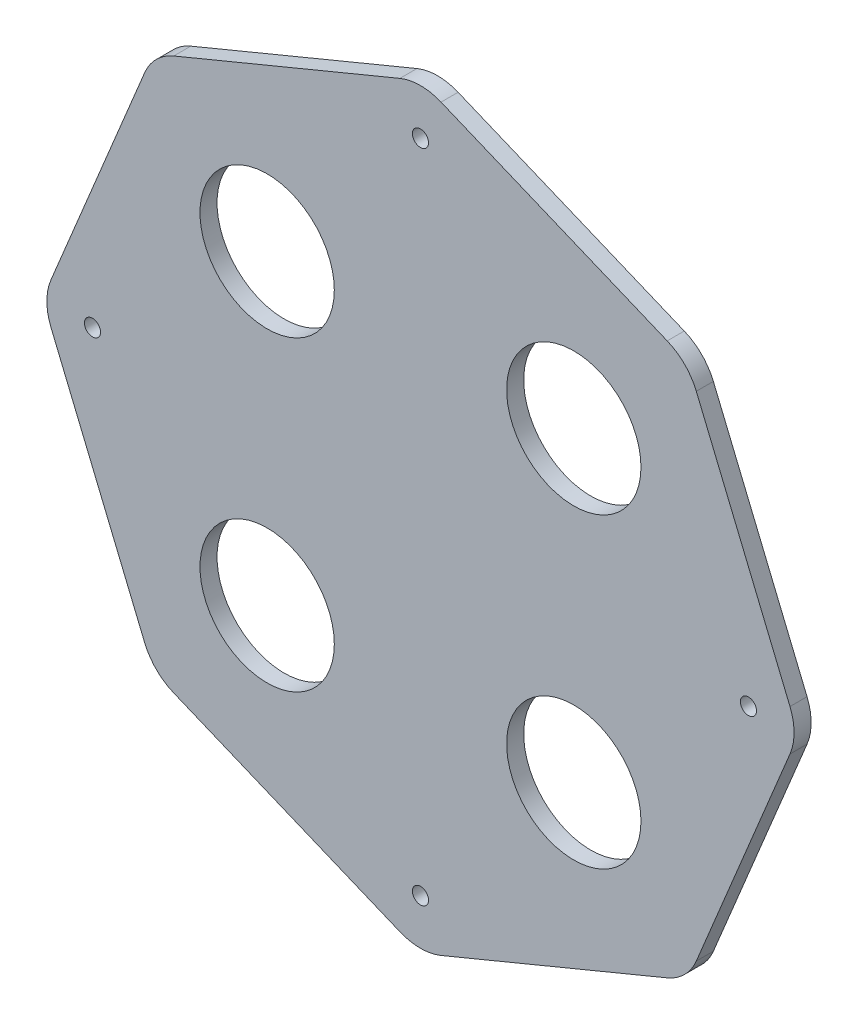
ISO-10303-21;
HEADER;
FILE_DESCRIPTION(('STEP AP214'),'2;1');
FILE_NAME('part.step','',(''),(''),'','','');
FILE_SCHEMA(('AUTOMOTIVE_DESIGN { 1 0 10303 214 1 1 1 1 }'));
ENDSEC;
DATA;
#1=APPLICATION_CONTEXT('core data for automotive mechanical design processes');
#2=APPLICATION_PROTOCOL_DEFINITION('international standard','automotive_design',2000,#1);
#3=PRODUCT_CONTEXT('',#1,'mechanical');
#4=PRODUCT('Part','Part','',(#3));
#5=PRODUCT_RELATED_PRODUCT_CATEGORY('part','',(#4));
#6=PRODUCT_DEFINITION_FORMATION('','',#4);
#7=PRODUCT_DEFINITION_CONTEXT('part definition',#1,'design');
#8=PRODUCT_DEFINITION('design','',#6,#7);
#9=PRODUCT_DEFINITION_SHAPE('','',#8);
#10=(LENGTH_UNIT() NAMED_UNIT(*) SI_UNIT(.MILLI.,.METRE.));
#11=(NAMED_UNIT(*) PLANE_ANGLE_UNIT() SI_UNIT($,.RADIAN.));
#12=(NAMED_UNIT(*) SI_UNIT($,.STERADIAN.) SOLID_ANGLE_UNIT());
#13=UNCERTAINTY_MEASURE_WITH_UNIT(LENGTH_MEASURE(1.E-05),#10,'distance_accuracy_value','');
#14=(GEOMETRIC_REPRESENTATION_CONTEXT(3) GLOBAL_UNCERTAINTY_ASSIGNED_CONTEXT((#13)) GLOBAL_UNIT_ASSIGNED_CONTEXT((#10,
#11,#12)) REPRESENTATION_CONTEXT('',''));
#15=CARTESIAN_POINT('',(0.,0.,0.));
#16=DIRECTION('',(0.,0.,1.));
#17=DIRECTION('',(1.,0.,0.));
#18=AXIS2_PLACEMENT_3D('',#15,#16,#17);
#19=CARTESIAN_POINT('',(0.,0.,3.175));
#20=DIRECTION('',(0.,0.,1.));
#21=DIRECTION('',(1.,0.,0.));
#22=AXIS2_PLACEMENT_3D('',#19,#20,#21);
#23=PLANE('',#22);
#24=CARTESIAN_POINT('',(-28.5356427718649,-28.5356427718656,3.175));
#25=DIRECTION('',(0.,0.,1.));
#26=DIRECTION('',(1.,0.,0.));
#27=AXIS2_PLACEMENT_3D('',#24,#25,#26);
#28=CIRCLE('',#27,12.5);
#29=CARTESIAN_POINT('',(-16.0356427718649,-28.5356427718656,3.175));
#30=VERTEX_POINT('',#29);
#31=EDGE_CURVE('E397',#30,#30,#28,.T.);
#32=ORIENTED_EDGE('',*,*,#31,.F.);
#33=EDGE_LOOP('',(#32));
#34=FACE_BOUND('',#33,.T.);
#35=CARTESIAN_POINT('',(-28.5356427718656,28.5356427718649,3.175));
#36=DIRECTION('',(0.,0.,1.));
#37=DIRECTION('',(1.,0.,0.));
#38=AXIS2_PLACEMENT_3D('',#35,#36,#37);
#39=CIRCLE('',#38,12.5);
#40=CARTESIAN_POINT('',(-16.0356427718656,28.5356427718649,3.175));
#41=VERTEX_POINT('',#40);
#42=EDGE_CURVE('E385',#41,#41,#39,.T.);
#43=ORIENTED_EDGE('',*,*,#42,.F.);
#44=EDGE_LOOP('',(#43));
#45=FACE_BOUND('',#44,.T.);
#46=CARTESIAN_POINT('',(0.,-61.04,3.175));
#47=DIRECTION('',(0.,0.,1.));
#48=DIRECTION('',(1.,0.,0.));
#49=AXIS2_PLACEMENT_3D('',#46,#47,#48);
#50=CIRCLE('',#49,1.5);
#51=CARTESIAN_POINT('',(1.50000000000001,-61.04,3.175));
#52=VERTEX_POINT('',#51);
#53=EDGE_CURVE('E373',#52,#52,#50,.T.);
#54=ORIENTED_EDGE('',*,*,#53,.F.);
#55=EDGE_LOOP('',(#54));
#56=FACE_BOUND('',#55,.T.);
#57=CARTESIAN_POINT('',(0.,61.04,3.175));
#58=DIRECTION('',(0.,0.,1.));
#59=DIRECTION('',(1.,0.,0.));
#60=AXIS2_PLACEMENT_3D('',#57,#58,#59);
#61=CIRCLE('',#60,1.5);
#62=CARTESIAN_POINT('',(1.49999999999997,61.04,3.175));
#63=VERTEX_POINT('',#62);
#64=EDGE_CURVE('E272',#63,#63,#61,.T.);
#65=ORIENTED_EDGE('',*,*,#64,.F.);
#66=EDGE_LOOP('',(#65));
#67=FACE_BOUND('',#66,.T.);
#68=DIRECTION('',(-0.923879532511286,-0.382683432365091,0.));
#69=VECTOR('',#68,1.);
#70=CARTESIAN_POINT('',(0.,70.3554930190056,3.175));
#71=LINE('',#70,#69);
#72=CARTESIAN_POINT('',(-3.82683432365083,68.7703663411945,3.175));
#73=VERTEX_POINT('',#72);
#74=CARTESIAN_POINT('',(-45.9220118838111,51.3339728852725,3.175));
#75=VERTEX_POINT('',#74);
#76=EDGE_CURVE('E251',#73,#75,#71,.T.);
#77=ORIENTED_EDGE('',*,*,#76,.T.);
#78=CARTESIAN_POINT('',(-42.0951775601602,42.0951775601596,3.175));
#79=DIRECTION('',(0.,0.,1.));
#80=DIRECTION('',(1.,0.,0.));
#81=AXIS2_PLACEMENT_3D('',#78,#79,#80);
#82=CIRCLE('',#81,10.);
#83=CARTESIAN_POINT('',(-51.3339728852731,45.9220118838104,3.175));
#84=VERTEX_POINT('',#83);
#85=EDGE_CURVE('E11',#75,#84,#82,.T.);
#86=ORIENTED_EDGE('',*,*,#85,.T.);
#87=DIRECTION('',(-0.382683432365086,-0.923879532511288,0.));
#88=VECTOR('',#87,1.);
#89=CARTESIAN_POINT('',(-49.748846207462,49.7488462074614,3.175));
#90=LINE('',#89,#88);
#91=CARTESIAN_POINT('',(-68.7703663411945,3.82683432365086,3.175));
#92=VERTEX_POINT('',#91);
#93=EDGE_CURVE('E246',#84,#92,#90,.T.);
#94=ORIENTED_EDGE('',*,*,#93,.T.);
#95=CARTESIAN_POINT('',(-59.5315710160817,0.,3.175));
#96=DIRECTION('',(0.,0.,1.));
#97=DIRECTION('',(1.,0.,0.));
#98=AXIS2_PLACEMENT_3D('',#95,#96,#97);
#99=CIRCLE('',#98,10.);
#100=CARTESIAN_POINT('',(-68.7703663411945,-3.82683432365092,3.175));
#101=VERTEX_POINT('',#100);
#102=EDGE_CURVE('E209',#92,#101,#99,.T.);
#103=ORIENTED_EDGE('',*,*,#102,.T.);
#104=DIRECTION('',(0.382683432365093,-0.923879532511285,0.));
#105=VECTOR('',#104,1.);
#106=CARTESIAN_POINT('',(-70.3554930190056,0.,3.175));
#107=LINE('',#106,#105);
#108=CARTESIAN_POINT('',(-51.3339728852724,-45.9220118838111,3.175));
#109=VERTEX_POINT('',#108);
#110=EDGE_CURVE('E164',#101,#109,#107,.T.);
#111=ORIENTED_EDGE('',*,*,#110,.T.);
#112=CARTESIAN_POINT('',(-42.0951775601596,-42.0951775601602,3.175));
#113=DIRECTION('',(0.,0.,1.));
#114=DIRECTION('',(1.,0.,0.));
#115=AXIS2_PLACEMENT_3D('',#112,#113,#114);
#116=CIRCLE('',#115,10.);
#117=CARTESIAN_POINT('',(-45.9220118838104,-51.333972885273,3.175));
#118=VERTEX_POINT('',#117);
#119=EDGE_CURVE('E207',#109,#118,#116,.T.);
#120=ORIENTED_EDGE('',*,*,#119,.T.);
#121=DIRECTION('',(0.923879532511288,-0.382683432365088,0.));
#122=VECTOR('',#121,1.);
#123=CARTESIAN_POINT('',(-49.7488462074613,-49.748846207462,3.175));
#124=LINE('',#123,#122);
#125=CARTESIAN_POINT('',(-3.82683432365091,-68.7703663411946,3.175));
#126=VERTEX_POINT('',#125);
#127=EDGE_CURVE('E263',#118,#126,#124,.T.);
#128=ORIENTED_EDGE('',*,*,#127,.T.);
#129=CARTESIAN_POINT('',(0.,-59.5315710160817,3.175));
#130=DIRECTION('',(0.,0.,1.));
#131=DIRECTION('',(1.,0.,0.));
#132=AXIS2_PLACEMENT_3D('',#129,#130,#131);
#133=CIRCLE('',#132,10.);
#134=CARTESIAN_POINT('',(3.82683432365091,-68.7703663411946,3.175));
#135=VERTEX_POINT('',#134);
#136=EDGE_CURVE('E205',#126,#135,#133,.T.);
#137=ORIENTED_EDGE('',*,*,#136,.T.);
#138=DIRECTION('',(0.923879532511285,0.382683432365094,0.));
#139=VECTOR('',#138,1.);
#140=CARTESIAN_POINT('',(0.,-70.3554930190057,3.175));
#141=LINE('',#140,#139);
#142=CARTESIAN_POINT('',(45.9220118838111,-51.3339728852724,3.175));
#143=VERTEX_POINT('',#142);
#144=EDGE_CURVE('E184',#135,#143,#141,.T.);
#145=ORIENTED_EDGE('',*,*,#144,.T.);
#146=CARTESIAN_POINT('',(42.0951775601602,-42.0951775601596,3.175));
#147=DIRECTION('',(0.,0.,1.));
#148=DIRECTION('',(1.,0.,0.));
#149=AXIS2_PLACEMENT_3D('',#146,#147,#148);
#150=CIRCLE('',#149,10.);
#151=CARTESIAN_POINT('',(51.333972885273,-45.9220118838105,3.175));
#152=VERTEX_POINT('',#151);
#153=EDGE_CURVE('E203',#143,#152,#150,.T.);
#154=ORIENTED_EDGE('',*,*,#153,.T.);
#155=DIRECTION('',(0.382683432365088,0.923879532511287,0.));
#156=VECTOR('',#155,1.);
#157=CARTESIAN_POINT('',(49.748846207462,-49.7488462074613,3.175));
#158=LINE('',#157,#156);
#159=CARTESIAN_POINT('',(68.7703663411946,-3.826834323651,3.175));
#160=VERTEX_POINT('',#159);
#161=EDGE_CURVE('E183',#152,#160,#158,.T.);
#162=ORIENTED_EDGE('',*,*,#161,.T.);
#163=CARTESIAN_POINT('',(59.5315710160817,-1.14058068545475E-13,3.175));
#164=DIRECTION('',(0.,0.,1.));
#165=DIRECTION('',(1.,0.,0.));
#166=AXIS2_PLACEMENT_3D('',#163,#164,#165);
#167=CIRCLE('',#166,10.);
#168=CARTESIAN_POINT('',(68.7703663411946,3.82683432365082,3.175));
#169=VERTEX_POINT('',#168);
#170=EDGE_CURVE('E201',#160,#169,#167,.T.);
#171=ORIENTED_EDGE('',*,*,#170,.T.);
#172=DIRECTION('',(-0.382683432365093,0.923879532511285,0.));
#173=VECTOR('',#172,1.);
#174=CARTESIAN_POINT('',(70.3554930190056,0.,3.175));
#175=LINE('',#174,#173);
#176=CARTESIAN_POINT('',(51.3339728852724,45.9220118838111,3.175));
#177=VERTEX_POINT('',#176);
#178=EDGE_CURVE('E258',#169,#177,#175,.T.);
#179=ORIENTED_EDGE('',*,*,#178,.T.);
#180=CARTESIAN_POINT('',(42.0951775601595,42.0951775601602,3.175));
#181=DIRECTION('',(0.,0.,1.));
#182=DIRECTION('',(1.,0.,0.));
#183=AXIS2_PLACEMENT_3D('',#180,#181,#182);
#184=CIRCLE('',#183,10.);
#185=CARTESIAN_POINT('',(45.9220118838104,51.3339728852731,3.175));
#186=VERTEX_POINT('',#185);
#187=EDGE_CURVE('E199',#177,#186,#184,.T.);
#188=ORIENTED_EDGE('',*,*,#187,.T.);
#189=DIRECTION('',(-0.923879532511288,0.382683432365086,0.));
#190=VECTOR('',#189,1.);
#191=CARTESIAN_POINT('',(49.7488462074613,49.748846207462,3.175));
#192=LINE('',#191,#190);
#193=CARTESIAN_POINT('',(3.82683432365096,68.7703663411945,3.175));
#194=VERTEX_POINT('',#193);
#195=EDGE_CURVE('E255',#186,#194,#192,.T.);
#196=ORIENTED_EDGE('',*,*,#195,.T.);
#197=CARTESIAN_POINT('',(0.,59.5315710160816,3.175));
#198=DIRECTION('',(0.,0.,1.));
#199=DIRECTION('',(1.,0.,0.));
#200=AXIS2_PLACEMENT_3D('',#197,#198,#199);
#201=CIRCLE('',#200,10.);
#202=EDGE_CURVE('E197',#194,#73,#201,.T.);
#203=ORIENTED_EDGE('',*,*,#202,.T.);
#204=EDGE_LOOP('',(#77,#86,#94,#103,#111,#120,#128,#137,#145,#154,#162,#171,#179,#188,#196,#203));
#205=FACE_BOUND('',#204,.T.);
#206=CARTESIAN_POINT('',(61.04,0.,3.175));
#207=DIRECTION('',(0.,0.,1.));
#208=DIRECTION('',(1.,0.,0.));
#209=AXIS2_PLACEMENT_3D('',#206,#207,#208);
#210=CIRCLE('',#209,1.5);
#211=CARTESIAN_POINT('',(62.54,0.,3.175));
#212=VERTEX_POINT('',#211);
#213=EDGE_CURVE('E367',#212,#212,#210,.T.);
#214=ORIENTED_EDGE('',*,*,#213,.F.);
#215=EDGE_LOOP('',(#214));
#216=FACE_BOUND('',#215,.T.);
#217=CARTESIAN_POINT('',(-61.04,0.,3.175));
#218=DIRECTION('',(0.,0.,1.));
#219=DIRECTION('',(1.,0.,0.));
#220=AXIS2_PLACEMENT_3D('',#217,#218,#219);
#221=CIRCLE('',#220,1.5);
#222=CARTESIAN_POINT('',(-59.54,0.,3.175));
#223=VERTEX_POINT('',#222);
#224=EDGE_CURVE('E379',#223,#223,#221,.T.);
#225=ORIENTED_EDGE('',*,*,#224,.F.);
#226=EDGE_LOOP('',(#225));
#227=FACE_BOUND('',#226,.T.);
#228=CARTESIAN_POINT('',(28.5356427718649,28.5356427718656,3.175));
#229=DIRECTION('',(0.,0.,1.));
#230=DIRECTION('',(1.,0.,0.));
#231=AXIS2_PLACEMENT_3D('',#228,#229,#230);
#232=CIRCLE('',#231,12.5);
#233=CARTESIAN_POINT('',(41.0356427718649,28.5356427718656,3.175));
#234=VERTEX_POINT('',#233);
#235=EDGE_CURVE('E391',#234,#234,#232,.T.);
#236=ORIENTED_EDGE('',*,*,#235,.F.);
#237=EDGE_LOOP('',(#236));
#238=FACE_BOUND('',#237,.T.);
#239=CARTESIAN_POINT('',(28.5356427718655,-28.5356427718649,3.175));
#240=DIRECTION('',(0.,0.,1.));
#241=DIRECTION('',(1.,0.,0.));
#242=AXIS2_PLACEMENT_3D('',#239,#240,#241);
#243=CIRCLE('',#242,12.5);
#244=CARTESIAN_POINT('',(41.0356427718656,-28.5356427718649,3.175));
#245=VERTEX_POINT('',#244);
#246=EDGE_CURVE('E403',#245,#245,#243,.T.);
#247=ORIENTED_EDGE('',*,*,#246,.F.);
#248=EDGE_LOOP('',(#247));
#249=FACE_BOUND('',#248,.T.);
#250=ADVANCED_FACE('F33',(#34,#45,#56,#67,#205,#216,#227,#238,#249),#23,.T.);
#251=CARTESIAN_POINT('',(0.,0.,0.));
#252=DIRECTION('',(0.,0.,1.));
#253=DIRECTION('',(1.,0.,0.));
#254=AXIS2_PLACEMENT_3D('',#251,#252,#253);
#255=PLANE('',#254);
#256=CARTESIAN_POINT('',(-28.5356427718649,-28.5356427718656,0.));
#257=DIRECTION('',(0.,0.,1.));
#258=DIRECTION('',(1.,0.,0.));
#259=AXIS2_PLACEMENT_3D('',#256,#257,#258);
#260=CIRCLE('',#259,12.5);
#261=CARTESIAN_POINT('',(-16.0356427718649,-28.5356427718656,0.));
#262=VERTEX_POINT('',#261);
#263=EDGE_CURVE('E400',#262,#262,#260,.T.);
#264=ORIENTED_EDGE('',*,*,#263,.T.);
#265=EDGE_LOOP('',(#264));
#266=FACE_BOUND('',#265,.T.);
#267=CARTESIAN_POINT('',(-28.5356427718656,28.5356427718649,0.));
#268=DIRECTION('',(0.,0.,1.));
#269=DIRECTION('',(1.,0.,0.));
#270=AXIS2_PLACEMENT_3D('',#267,#268,#269);
#271=CIRCLE('',#270,12.5);
#272=CARTESIAN_POINT('',(-16.0356427718656,28.5356427718649,0.));
#273=VERTEX_POINT('',#272);
#274=EDGE_CURVE('E388',#273,#273,#271,.T.);
#275=ORIENTED_EDGE('',*,*,#274,.T.);
#276=EDGE_LOOP('',(#275));
#277=FACE_BOUND('',#276,.T.);
#278=CARTESIAN_POINT('',(0.,-61.04,0.));
#279=DIRECTION('',(0.,0.,1.));
#280=DIRECTION('',(1.,0.,0.));
#281=AXIS2_PLACEMENT_3D('',#278,#279,#280);
#282=CIRCLE('',#281,1.5);
#283=CARTESIAN_POINT('',(1.50000000000001,-61.04,0.));
#284=VERTEX_POINT('',#283);
#285=EDGE_CURVE('E376',#284,#284,#282,.T.);
#286=ORIENTED_EDGE('',*,*,#285,.T.);
#287=EDGE_LOOP('',(#286));
#288=FACE_BOUND('',#287,.T.);
#289=CARTESIAN_POINT('',(0.,61.04,0.));
#290=DIRECTION('',(0.,0.,1.));
#291=DIRECTION('',(1.,0.,0.));
#292=AXIS2_PLACEMENT_3D('',#289,#290,#291);
#293=CIRCLE('',#292,1.5);
#294=CARTESIAN_POINT('',(1.49999999999997,61.04,0.));
#295=VERTEX_POINT('',#294);
#296=EDGE_CURVE('E364',#295,#295,#293,.T.);
#297=ORIENTED_EDGE('',*,*,#296,.T.);
#298=EDGE_LOOP('',(#297));
#299=FACE_BOUND('',#298,.T.);
#300=DIRECTION('',(-0.382683432365086,-0.923879532511288,0.));
#301=VECTOR('',#300,1.);
#302=CARTESIAN_POINT('',(-49.748846207462,49.7488462074614,0.));
#303=LINE('',#302,#301);
#304=CARTESIAN_POINT('',(-51.3339728852731,45.9220118838104,0.));
#305=VERTEX_POINT('',#304);
#306=CARTESIAN_POINT('',(-68.7703663411945,3.82683432365086,0.));
#307=VERTEX_POINT('',#306);
#308=EDGE_CURVE('E172',#305,#307,#303,.T.);
#309=ORIENTED_EDGE('',*,*,#308,.F.);
#310=CARTESIAN_POINT('',(-42.0951775601602,42.0951775601596,0.));
#311=DIRECTION('',(0.,0.,1.));
#312=DIRECTION('',(1.,0.,0.));
#313=AXIS2_PLACEMENT_3D('',#310,#311,#312);
#314=CIRCLE('',#313,10.);
#315=CARTESIAN_POINT('',(-45.9220118838111,51.3339728852725,0.));
#316=VERTEX_POINT('',#315);
#317=EDGE_CURVE('E55',#305,#316,#314,.F.);
#318=ORIENTED_EDGE('',*,*,#317,.T.);
#319=DIRECTION('',(-0.923879532511286,-0.382683432365091,0.));
#320=VECTOR('',#319,1.);
#321=CARTESIAN_POINT('',(0.,70.3554930190056,0.));
#322=LINE('',#321,#320);
#323=CARTESIAN_POINT('',(-3.82683432365083,68.7703663411945,0.));
#324=VERTEX_POINT('',#323);
#325=EDGE_CURVE('E177',#324,#316,#322,.T.);
#326=ORIENTED_EDGE('',*,*,#325,.F.);
#327=CARTESIAN_POINT('',(0.,59.5315710160816,0.));
#328=DIRECTION('',(0.,0.,1.));
#329=DIRECTION('',(1.,0.,0.));
#330=AXIS2_PLACEMENT_3D('',#327,#328,#329);
#331=CIRCLE('',#330,10.);
#332=CARTESIAN_POINT('',(3.82683432365096,68.7703663411945,0.));
#333=VERTEX_POINT('',#332);
#334=EDGE_CURVE('E165',#324,#333,#331,.F.);
#335=ORIENTED_EDGE('',*,*,#334,.T.);
#336=DIRECTION('',(-0.923879532511288,0.382683432365086,0.));
#337=VECTOR('',#336,1.);
#338=CARTESIAN_POINT('',(49.7488462074613,49.748846207462,0.));
#339=LINE('',#338,#337);
#340=CARTESIAN_POINT('',(45.9220118838104,51.3339728852731,0.));
#341=VERTEX_POINT('',#340);
#342=EDGE_CURVE('E275',#341,#333,#339,.T.);
#343=ORIENTED_EDGE('',*,*,#342,.F.);
#344=CARTESIAN_POINT('',(42.0951775601595,42.0951775601602,0.));
#345=DIRECTION('',(0.,0.,1.));
#346=DIRECTION('',(1.,0.,0.));
#347=AXIS2_PLACEMENT_3D('',#344,#345,#346);
#348=CIRCLE('',#347,10.);
#349=CARTESIAN_POINT('',(51.3339728852724,45.9220118838111,0.));
#350=VERTEX_POINT('',#349);
#351=EDGE_CURVE('E187',#341,#350,#348,.F.);
#352=ORIENTED_EDGE('',*,*,#351,.T.);
#353=DIRECTION('',(-0.382683432365093,0.923879532511285,0.));
#354=VECTOR('',#353,1.);
#355=CARTESIAN_POINT('',(70.3554930190056,0.,0.));
#356=LINE('',#355,#354);
#357=CARTESIAN_POINT('',(68.7703663411946,3.82683432365082,0.));
#358=VERTEX_POINT('',#357);
#359=EDGE_CURVE('E271',#358,#350,#356,.T.);
#360=ORIENTED_EDGE('',*,*,#359,.F.);
#361=CARTESIAN_POINT('',(59.5315710160817,-1.14058068545475E-13,0.));
#362=DIRECTION('',(0.,0.,1.));
#363=DIRECTION('',(1.,0.,0.));
#364=AXIS2_PLACEMENT_3D('',#361,#362,#363);
#365=CIRCLE('',#364,10.);
#366=CARTESIAN_POINT('',(68.7703663411946,-3.826834323651,0.));
#367=VERTEX_POINT('',#366);
#368=EDGE_CURVE('E189',#358,#367,#365,.F.);
#369=ORIENTED_EDGE('',*,*,#368,.T.);
#370=DIRECTION('',(0.382683432365088,0.923879532511287,0.));
#371=VECTOR('',#370,1.);
#372=CARTESIAN_POINT('',(49.748846207462,-49.7488462074613,0.));
#373=LINE('',#372,#371);
#374=CARTESIAN_POINT('',(51.333972885273,-45.9220118838105,0.));
#375=VERTEX_POINT('',#374);
#376=EDGE_CURVE('E268',#375,#367,#373,.T.);
#377=ORIENTED_EDGE('',*,*,#376,.F.);
#378=CARTESIAN_POINT('',(42.0951775601602,-42.0951775601596,0.));
#379=DIRECTION('',(0.,0.,1.));
#380=DIRECTION('',(1.,0.,0.));
#381=AXIS2_PLACEMENT_3D('',#378,#379,#380);
#382=CIRCLE('',#381,10.);
#383=CARTESIAN_POINT('',(45.9220118838111,-51.3339728852724,0.));
#384=VERTEX_POINT('',#383);
#385=EDGE_CURVE('E191',#375,#384,#382,.F.);
#386=ORIENTED_EDGE('',*,*,#385,.T.);
#387=DIRECTION('',(0.923879532511285,0.382683432365094,0.));
#388=VECTOR('',#387,1.);
#389=CARTESIAN_POINT('',(0.,-70.3554930190057,0.));
#390=LINE('',#389,#388);
#391=CARTESIAN_POINT('',(3.82683432365091,-68.7703663411946,0.));
#392=VERTEX_POINT('',#391);
#393=EDGE_CURVE('E175',#392,#384,#390,.T.);
#394=ORIENTED_EDGE('',*,*,#393,.F.);
#395=CARTESIAN_POINT('',(0.,-59.5315710160817,0.));
#396=DIRECTION('',(0.,0.,1.));
#397=DIRECTION('',(1.,0.,0.));
#398=AXIS2_PLACEMENT_3D('',#395,#396,#397);
#399=CIRCLE('',#398,10.);
#400=CARTESIAN_POINT('',(-3.82683432365091,-68.7703663411946,0.));
#401=VERTEX_POINT('',#400);
#402=EDGE_CURVE('E193',#392,#401,#399,.F.);
#403=ORIENTED_EDGE('',*,*,#402,.T.);
#404=DIRECTION('',(0.923879532511288,-0.382683432365088,0.));
#405=VECTOR('',#404,1.);
#406=CARTESIAN_POINT('',(-49.7488462074613,-49.748846207462,0.));
#407=LINE('',#406,#405);
#408=CARTESIAN_POINT('',(-45.9220118838104,-51.333972885273,0.));
#409=VERTEX_POINT('',#408);
#410=EDGE_CURVE('E171',#409,#401,#407,.T.);
#411=ORIENTED_EDGE('',*,*,#410,.F.);
#412=CARTESIAN_POINT('',(-42.0951775601596,-42.0951775601602,0.));
#413=DIRECTION('',(0.,0.,1.));
#414=DIRECTION('',(1.,0.,0.));
#415=AXIS2_PLACEMENT_3D('',#412,#413,#414);
#416=CIRCLE('',#415,10.);
#417=CARTESIAN_POINT('',(-51.3339728852724,-45.9220118838111,0.));
#418=VERTEX_POINT('',#417);
#419=EDGE_CURVE('E155',#409,#418,#416,.F.);
#420=ORIENTED_EDGE('',*,*,#419,.T.);
#421=DIRECTION('',(0.382683432365093,-0.923879532511285,0.));
#422=VECTOR('',#421,1.);
#423=CARTESIAN_POINT('',(-70.3554930190056,0.,0.));
#424=LINE('',#423,#422);
#425=CARTESIAN_POINT('',(-68.7703663411945,-3.82683432365092,0.));
#426=VERTEX_POINT('',#425);
#427=EDGE_CURVE('E161',#426,#418,#424,.T.);
#428=ORIENTED_EDGE('',*,*,#427,.F.);
#429=CARTESIAN_POINT('',(-59.5315710160817,0.,0.));
#430=DIRECTION('',(0.,0.,1.));
#431=DIRECTION('',(1.,0.,0.));
#432=AXIS2_PLACEMENT_3D('',#429,#430,#431);
#433=CIRCLE('',#432,10.);
#434=EDGE_CURVE('E147',#426,#307,#433,.F.);
#435=ORIENTED_EDGE('',*,*,#434,.T.);
#436=EDGE_LOOP('',(#309,#318,#326,#335,#343,#352,#360,#369,#377,#386,#394,#403,#411,#420,#428,#435));
#437=FACE_BOUND('',#436,.T.);
#438=CARTESIAN_POINT('',(61.04,0.,0.));
#439=DIRECTION('',(0.,0.,1.));
#440=DIRECTION('',(1.,0.,0.));
#441=AXIS2_PLACEMENT_3D('',#438,#439,#440);
#442=CIRCLE('',#441,1.5);
#443=CARTESIAN_POINT('',(62.54,0.,0.));
#444=VERTEX_POINT('',#443);
#445=EDGE_CURVE('E370',#444,#444,#442,.T.);
#446=ORIENTED_EDGE('',*,*,#445,.T.);
#447=EDGE_LOOP('',(#446));
#448=FACE_BOUND('',#447,.T.);
#449=CARTESIAN_POINT('',(-61.04,0.,0.));
#450=DIRECTION('',(0.,0.,1.));
#451=DIRECTION('',(1.,0.,0.));
#452=AXIS2_PLACEMENT_3D('',#449,#450,#451);
#453=CIRCLE('',#452,1.5);
#454=CARTESIAN_POINT('',(-59.54,0.,0.));
#455=VERTEX_POINT('',#454);
#456=EDGE_CURVE('E382',#455,#455,#453,.T.);
#457=ORIENTED_EDGE('',*,*,#456,.T.);
#458=EDGE_LOOP('',(#457));
#459=FACE_BOUND('',#458,.T.);
#460=CARTESIAN_POINT('',(28.5356427718649,28.5356427718656,0.));
#461=DIRECTION('',(0.,0.,1.));
#462=DIRECTION('',(1.,0.,0.));
#463=AXIS2_PLACEMENT_3D('',#460,#461,#462);
#464=CIRCLE('',#463,12.5);
#465=CARTESIAN_POINT('',(41.0356427718649,28.5356427718656,0.));
#466=VERTEX_POINT('',#465);
#467=EDGE_CURVE('E394',#466,#466,#464,.T.);
#468=ORIENTED_EDGE('',*,*,#467,.T.);
#469=EDGE_LOOP('',(#468));
#470=FACE_BOUND('',#469,.T.);
#471=CARTESIAN_POINT('',(28.5356427718655,-28.5356427718649,0.));
#472=DIRECTION('',(0.,0.,1.));
#473=DIRECTION('',(1.,0.,0.));
#474=AXIS2_PLACEMENT_3D('',#471,#472,#473);
#475=CIRCLE('',#474,12.5);
#476=CARTESIAN_POINT('',(41.0356427718656,-28.5356427718649,0.));
#477=VERTEX_POINT('',#476);
#478=EDGE_CURVE('E406',#477,#477,#475,.T.);
#479=ORIENTED_EDGE('',*,*,#478,.T.);
#480=EDGE_LOOP('',(#479));
#481=FACE_BOUND('',#480,.T.);
#482=ADVANCED_FACE('F168',(#266,#277,#288,#299,#437,#448,#459,#470,#481),#255,.F.);
#483=CARTESIAN_POINT('',(49.748846207462,-49.7488462074613,3.175));
#484=DIRECTION('',(-0.923879532511287,0.382683432365088,0.));
#485=DIRECTION('',(-0.382683432365088,-0.923879532511287,0.));
#486=AXIS2_PLACEMENT_3D('',#483,#484,#485);
#487=PLANE('',#486);
#488=ORIENTED_EDGE('',*,*,#161,.F.);
#489=DIRECTION('',(0.,0.,-1.));
#490=VECTOR('',#489,1.);
#491=CARTESIAN_POINT('',(51.333972885273,-45.9220118838105,3.175));
#492=LINE('',#491,#490);
#493=EDGE_CURVE('E223',#152,#375,#492,.T.);
#494=ORIENTED_EDGE('',*,*,#493,.T.);
#495=ORIENTED_EDGE('',*,*,#376,.T.);
#496=DIRECTION('',(0.,0.,-1.));
#497=VECTOR('',#496,1.);
#498=CARTESIAN_POINT('',(68.7703663411946,-3.826834323651,3.175));
#499=LINE('',#498,#497);
#500=EDGE_CURVE('E221',#367,#160,#499,.F.);
#501=ORIENTED_EDGE('',*,*,#500,.T.);
#502=EDGE_LOOP('',(#488,#494,#495,#501));
#503=FACE_BOUND('',#502,.T.);
#504=ADVANCED_FACE('F301',(#503),#487,.F.);
#505=CARTESIAN_POINT('',(70.3554930190056,0.,3.175));
#506=DIRECTION('',(-0.923879532511285,-0.382683432365093,0.));
#507=DIRECTION('',(0.382683432365093,-0.923879532511285,0.));
#508=AXIS2_PLACEMENT_3D('',#505,#506,#507);
#509=PLANE('',#508);
#510=ORIENTED_EDGE('',*,*,#178,.F.);
#511=DIRECTION('',(0.,0.,-1.));
#512=VECTOR('',#511,1.);
#513=CARTESIAN_POINT('',(68.7703663411946,3.82683432365082,3.175));
#514=LINE('',#513,#512);
#515=EDGE_CURVE('E228',#169,#358,#514,.T.);
#516=ORIENTED_EDGE('',*,*,#515,.T.);
#517=ORIENTED_EDGE('',*,*,#359,.T.);
#518=DIRECTION('',(0.,0.,-1.));
#519=VECTOR('',#518,1.);
#520=CARTESIAN_POINT('',(51.3339728852724,45.9220118838111,3.175));
#521=LINE('',#520,#519);
#522=EDGE_CURVE('E226',#350,#177,#521,.F.);
#523=ORIENTED_EDGE('',*,*,#522,.T.);
#524=EDGE_LOOP('',(#510,#516,#517,#523));
#525=FACE_BOUND('',#524,.T.);
#526=ADVANCED_FACE('F326',(#525),#509,.F.);
#527=CARTESIAN_POINT('',(49.7488462074613,49.748846207462,3.175));
#528=DIRECTION('',(-0.382683432365086,-0.923879532511288,0.));
#529=DIRECTION('',(0.923879532511288,-0.382683432365086,0.));
#530=AXIS2_PLACEMENT_3D('',#527,#528,#529);
#531=PLANE('',#530);
#532=ORIENTED_EDGE('',*,*,#195,.F.);
#533=DIRECTION('',(0.,0.,-1.));
#534=VECTOR('',#533,1.);
#535=CARTESIAN_POINT('',(45.9220118838104,51.3339728852731,3.175));
#536=LINE('',#535,#534);
#537=EDGE_CURVE('E233',#186,#341,#536,.T.);
#538=ORIENTED_EDGE('',*,*,#537,.T.);
#539=ORIENTED_EDGE('',*,*,#342,.T.);
#540=DIRECTION('',(0.,0.,-1.));
#541=VECTOR('',#540,1.);
#542=CARTESIAN_POINT('',(3.82683432365095,68.7703663411945,3.175));
#543=LINE('',#542,#541);
#544=EDGE_CURVE('E231',#333,#194,#543,.F.);
#545=ORIENTED_EDGE('',*,*,#544,.T.);
#546=EDGE_LOOP('',(#532,#538,#539,#545));
#547=FACE_BOUND('',#546,.T.);
#548=ADVANCED_FACE('F283',(#547),#531,.F.);
#549=CARTESIAN_POINT('',(0.,70.3554930190056,3.175));
#550=DIRECTION('',(0.382683432365091,-0.923879532511286,0.));
#551=DIRECTION('',(0.923879532511286,0.382683432365091,0.));
#552=AXIS2_PLACEMENT_3D('',#549,#550,#551);
#553=PLANE('',#552);
#554=ORIENTED_EDGE('',*,*,#325,.T.);
#555=DIRECTION('',(0.,0.,-1.));
#556=VECTOR('',#555,1.);
#557=CARTESIAN_POINT('',(-45.9220118838111,51.3339728852725,3.175));
#558=LINE('',#557,#556);
#559=EDGE_CURVE('E41',#316,#75,#558,.F.);
#560=ORIENTED_EDGE('',*,*,#559,.T.);
#561=ORIENTED_EDGE('',*,*,#76,.F.);
#562=DIRECTION('',(0.,0.,-1.));
#563=VECTOR('',#562,1.);
#564=CARTESIAN_POINT('',(-3.82683432365082,68.7703663411945,3.175));
#565=LINE('',#564,#563);
#566=EDGE_CURVE('E236',#73,#324,#565,.T.);
#567=ORIENTED_EDGE('',*,*,#566,.T.);
#568=EDGE_LOOP('',(#554,#560,#561,#567));
#569=FACE_BOUND('',#568,.T.);
#570=ADVANCED_FACE('F277',(#569),#553,.F.);
#571=CARTESIAN_POINT('',(-49.748846207462,49.7488462074614,3.175));
#572=DIRECTION('',(0.923879532511288,-0.382683432365086,0.));
#573=DIRECTION('',(0.382683432365086,0.923879532511289,0.));
#574=AXIS2_PLACEMENT_3D('',#571,#572,#573);
#575=PLANE('',#574);
#576=ORIENTED_EDGE('',*,*,#93,.F.);
#577=DIRECTION('',(0.,0.,-1.));
#578=VECTOR('',#577,1.);
#579=CARTESIAN_POINT('',(-51.3339728852731,45.9220118838104,3.175));
#580=LINE('',#579,#578);
#581=EDGE_CURVE('E239',#84,#305,#580,.T.);
#582=ORIENTED_EDGE('',*,*,#581,.T.);
#583=ORIENTED_EDGE('',*,*,#308,.T.);
#584=DIRECTION('',(0.,0.,-1.));
#585=VECTOR('',#584,1.);
#586=CARTESIAN_POINT('',(-68.7703663411945,3.82683432365087,3.175));
#587=LINE('',#586,#585);
#588=EDGE_CURVE('E153',#307,#92,#587,.F.);
#589=ORIENTED_EDGE('',*,*,#588,.T.);
#590=EDGE_LOOP('',(#576,#582,#583,#589));
#591=FACE_BOUND('',#590,.T.);
#592=ADVANCED_FACE('F245',(#591),#575,.F.);
#593=CARTESIAN_POINT('',(-70.3554930190056,0.,3.175));
#594=DIRECTION('',(0.923879532511285,0.382683432365093,0.));
#595=DIRECTION('',(-0.382683432365093,0.923879532511286,0.));
#596=AXIS2_PLACEMENT_3D('',#593,#594,#595);
#597=PLANE('',#596);
#598=ORIENTED_EDGE('',*,*,#110,.F.);
#599=DIRECTION('',(0.,0.,-1.));
#600=VECTOR('',#599,1.);
#601=CARTESIAN_POINT('',(-68.7703663411945,-3.82683432365093,3.175));
#602=LINE('',#601,#600);
#603=EDGE_CURVE('E151',#101,#426,#602,.T.);
#604=ORIENTED_EDGE('',*,*,#603,.T.);
#605=ORIENTED_EDGE('',*,*,#427,.T.);
#606=DIRECTION('',(0.,0.,-1.));
#607=VECTOR('',#606,1.);
#608=CARTESIAN_POINT('',(-51.3339728852724,-45.9220118838111,3.175));
#609=LINE('',#608,#607);
#610=EDGE_CURVE('E166',#418,#109,#609,.F.);
#611=ORIENTED_EDGE('',*,*,#610,.T.);
#612=EDGE_LOOP('',(#598,#604,#605,#611));
#613=FACE_BOUND('',#612,.T.);
#614=ADVANCED_FACE('F160',(#613),#597,.F.);
#615=CARTESIAN_POINT('',(-49.7488462074613,-49.748846207462,3.175));
#616=DIRECTION('',(0.382683432365088,0.923879532511288,0.));
#617=DIRECTION('',(-0.923879532511288,0.382683432365088,0.));
#618=AXIS2_PLACEMENT_3D('',#615,#616,#617);
#619=PLANE('',#618);
#620=ORIENTED_EDGE('',*,*,#127,.F.);
#621=DIRECTION('',(0.,0.,-1.));
#622=VECTOR('',#621,1.);
#623=CARTESIAN_POINT('',(-45.9220118838104,-51.333972885273,3.175));
#624=LINE('',#623,#622);
#625=EDGE_CURVE('E213',#118,#409,#624,.T.);
#626=ORIENTED_EDGE('',*,*,#625,.T.);
#627=ORIENTED_EDGE('',*,*,#410,.T.);
#628=DIRECTION('',(0.,0.,-1.));
#629=VECTOR('',#628,1.);
#630=CARTESIAN_POINT('',(-3.82683432365091,-68.7703663411946,3.175));
#631=LINE('',#630,#629);
#632=EDGE_CURVE('E211',#401,#126,#631,.F.);
#633=ORIENTED_EDGE('',*,*,#632,.T.);
#634=EDGE_LOOP('',(#620,#626,#627,#633));
#635=FACE_BOUND('',#634,.T.);
#636=ADVANCED_FACE('F313',(#635),#619,.F.);
#637=CARTESIAN_POINT('',(0.,-70.3554930190057,3.175));
#638=DIRECTION('',(-0.382683432365094,0.923879532511285,0.));
#639=DIRECTION('',(-0.923879532511285,-0.382683432365094,0.));
#640=AXIS2_PLACEMENT_3D('',#637,#638,#639);
#641=PLANE('',#640);
#642=ORIENTED_EDGE('',*,*,#144,.F.);
#643=DIRECTION('',(0.,0.,-1.));
#644=VECTOR('',#643,1.);
#645=CARTESIAN_POINT('',(3.82683432365091,-68.7703663411946,3.175));
#646=LINE('',#645,#644);
#647=EDGE_CURVE('E218',#135,#392,#646,.T.);
#648=ORIENTED_EDGE('',*,*,#647,.T.);
#649=ORIENTED_EDGE('',*,*,#393,.T.);
#650=DIRECTION('',(0.,0.,-1.));
#651=VECTOR('',#650,1.);
#652=CARTESIAN_POINT('',(45.9220118838111,-51.3339728852724,3.175));
#653=LINE('',#652,#651);
#654=EDGE_CURVE('E216',#384,#143,#653,.F.);
#655=ORIENTED_EDGE('',*,*,#654,.T.);
#656=EDGE_LOOP('',(#642,#648,#649,#655));
#657=FACE_BOUND('',#656,.T.);
#658=ADVANCED_FACE('F310',(#657),#641,.F.);
#659=CARTESIAN_POINT('',(0.,61.04,3.175));
#660=DIRECTION('',(0.,0.,-1.));
#661=DIRECTION('',(-1.,0.,0.));
#662=AXIS2_PLACEMENT_3D('',#659,#660,#661);
#663=CYLINDRICAL_SURFACE('',#662,1.5);
#664=ORIENTED_EDGE('',*,*,#64,.T.);
#665=EDGE_LOOP('',(#664));
#666=FACE_BOUND('',#665,.T.);
#667=ORIENTED_EDGE('',*,*,#296,.F.);
#668=EDGE_LOOP('',(#667));
#669=FACE_BOUND('',#668,.T.);
#670=ADVANCED_FACE('F307',(#666,#669),#663,.F.);
#671=CARTESIAN_POINT('',(61.04,0.,3.175));
#672=DIRECTION('',(0.,0.,-1.));
#673=DIRECTION('',(-1.,0.,0.));
#674=AXIS2_PLACEMENT_3D('',#671,#672,#673);
#675=CYLINDRICAL_SURFACE('',#674,1.5);
#676=ORIENTED_EDGE('',*,*,#213,.T.);
#677=EDGE_LOOP('',(#676));
#678=FACE_BOUND('',#677,.T.);
#679=ORIENTED_EDGE('',*,*,#445,.F.);
#680=EDGE_LOOP('',(#679));
#681=FACE_BOUND('',#680,.T.);
#682=ADVANCED_FACE('F439',(#678,#681),#675,.F.);
#683=CARTESIAN_POINT('',(0.,-61.04,3.175));
#684=DIRECTION('',(0.,0.,-1.));
#685=DIRECTION('',(-1.,0.,0.));
#686=AXIS2_PLACEMENT_3D('',#683,#684,#685);
#687=CYLINDRICAL_SURFACE('',#686,1.5);
#688=ORIENTED_EDGE('',*,*,#53,.T.);
#689=EDGE_LOOP('',(#688));
#690=FACE_BOUND('',#689,.T.);
#691=ORIENTED_EDGE('',*,*,#285,.F.);
#692=EDGE_LOOP('',(#691));
#693=FACE_BOUND('',#692,.T.);
#694=ADVANCED_FACE('F436',(#690,#693),#687,.F.);
#695=CARTESIAN_POINT('',(-61.04,0.,3.175));
#696=DIRECTION('',(0.,0.,-1.));
#697=DIRECTION('',(-1.,0.,0.));
#698=AXIS2_PLACEMENT_3D('',#695,#696,#697);
#699=CYLINDRICAL_SURFACE('',#698,1.5);
#700=ORIENTED_EDGE('',*,*,#224,.T.);
#701=EDGE_LOOP('',(#700));
#702=FACE_BOUND('',#701,.T.);
#703=ORIENTED_EDGE('',*,*,#456,.F.);
#704=EDGE_LOOP('',(#703));
#705=FACE_BOUND('',#704,.T.);
#706=ADVANCED_FACE('F432',(#702,#705),#699,.F.);
#707=CARTESIAN_POINT('',(-28.5356427718656,28.5356427718649,3.175));
#708=DIRECTION('',(0.,0.,-1.));
#709=DIRECTION('',(-1.,0.,0.));
#710=AXIS2_PLACEMENT_3D('',#707,#708,#709);
#711=CYLINDRICAL_SURFACE('',#710,12.5);
#712=ORIENTED_EDGE('',*,*,#42,.T.);
#713=EDGE_LOOP('',(#712));
#714=FACE_BOUND('',#713,.T.);
#715=ORIENTED_EDGE('',*,*,#274,.F.);
#716=EDGE_LOOP('',(#715));
#717=FACE_BOUND('',#716,.T.);
#718=ADVANCED_FACE('F428',(#714,#717),#711,.F.);
#719=CARTESIAN_POINT('',(28.5356427718649,28.5356427718656,3.175));
#720=DIRECTION('',(0.,0.,-1.));
#721=DIRECTION('',(-1.,0.,0.));
#722=AXIS2_PLACEMENT_3D('',#719,#720,#721);
#723=CYLINDRICAL_SURFACE('',#722,12.5);
#724=ORIENTED_EDGE('',*,*,#235,.T.);
#725=EDGE_LOOP('',(#724));
#726=FACE_BOUND('',#725,.T.);
#727=ORIENTED_EDGE('',*,*,#467,.F.);
#728=EDGE_LOOP('',(#727));
#729=FACE_BOUND('',#728,.T.);
#730=ADVANCED_FACE('F422',(#726,#729),#723,.F.);
#731=CARTESIAN_POINT('',(-28.5356427718649,-28.5356427718656,3.175));
#732=DIRECTION('',(0.,0.,-1.));
#733=DIRECTION('',(-1.,0.,0.));
#734=AXIS2_PLACEMENT_3D('',#731,#732,#733);
#735=CYLINDRICAL_SURFACE('',#734,12.5);
#736=ORIENTED_EDGE('',*,*,#31,.T.);
#737=EDGE_LOOP('',(#736));
#738=FACE_BOUND('',#737,.T.);
#739=ORIENTED_EDGE('',*,*,#263,.F.);
#740=EDGE_LOOP('',(#739));
#741=FACE_BOUND('',#740,.T.);
#742=ADVANCED_FACE('F415',(#738,#741),#735,.F.);
#743=CARTESIAN_POINT('',(28.5356427718655,-28.5356427718649,3.175));
#744=DIRECTION('',(0.,0.,-1.));
#745=DIRECTION('',(-1.,0.,0.));
#746=AXIS2_PLACEMENT_3D('',#743,#744,#745);
#747=CYLINDRICAL_SURFACE('',#746,12.5);
#748=ORIENTED_EDGE('',*,*,#246,.T.);
#749=EDGE_LOOP('',(#748));
#750=FACE_BOUND('',#749,.T.);
#751=ORIENTED_EDGE('',*,*,#478,.F.);
#752=EDGE_LOOP('',(#751));
#753=FACE_BOUND('',#752,.T.);
#754=ADVANCED_FACE('F336',(#750,#753),#747,.F.);
#755=CARTESIAN_POINT('',(-59.5315710160817,0.,3.175));
#756=DIRECTION('',(0.,0.,-1.));
#757=DIRECTION('',(-1.,0.,0.));
#758=AXIS2_PLACEMENT_3D('',#755,#756,#757);
#759=CYLINDRICAL_SURFACE('',#758,10.);
#760=ORIENTED_EDGE('',*,*,#102,.F.);
#761=ORIENTED_EDGE('',*,*,#588,.F.);
#762=ORIENTED_EDGE('',*,*,#434,.F.);
#763=ORIENTED_EDGE('',*,*,#603,.F.);
#764=EDGE_LOOP('',(#760,#761,#762,#763));
#765=FACE_BOUND('',#764,.T.);
#766=ADVANCED_FACE('F150',(#765),#759,.T.);
#767=CARTESIAN_POINT('',(-42.0951775601596,-42.0951775601602,3.175));
#768=DIRECTION('',(0.,0.,-1.));
#769=DIRECTION('',(-1.,0.,0.));
#770=AXIS2_PLACEMENT_3D('',#767,#768,#769);
#771=CYLINDRICAL_SURFACE('',#770,10.);
#772=ORIENTED_EDGE('',*,*,#119,.F.);
#773=ORIENTED_EDGE('',*,*,#610,.F.);
#774=ORIENTED_EDGE('',*,*,#419,.F.);
#775=ORIENTED_EDGE('',*,*,#625,.F.);
#776=EDGE_LOOP('',(#772,#773,#774,#775));
#777=FACE_BOUND('',#776,.T.);
#778=ADVANCED_FACE('F335',(#777),#771,.T.);
#779=CARTESIAN_POINT('',(0.,-59.5315710160817,3.175));
#780=DIRECTION('',(0.,0.,-1.));
#781=DIRECTION('',(-1.,0.,0.));
#782=AXIS2_PLACEMENT_3D('',#779,#780,#781);
#783=CYLINDRICAL_SURFACE('',#782,10.);
#784=ORIENTED_EDGE('',*,*,#136,.F.);
#785=ORIENTED_EDGE('',*,*,#632,.F.);
#786=ORIENTED_EDGE('',*,*,#402,.F.);
#787=ORIENTED_EDGE('',*,*,#647,.F.);
#788=EDGE_LOOP('',(#784,#785,#786,#787));
#789=FACE_BOUND('',#788,.T.);
#790=ADVANCED_FACE('F339',(#789),#783,.T.);
#791=CARTESIAN_POINT('',(42.0951775601602,-42.0951775601596,3.175));
#792=DIRECTION('',(0.,0.,-1.));
#793=DIRECTION('',(-1.,0.,0.));
#794=AXIS2_PLACEMENT_3D('',#791,#792,#793);
#795=CYLINDRICAL_SURFACE('',#794,10.);
#796=ORIENTED_EDGE('',*,*,#153,.F.);
#797=ORIENTED_EDGE('',*,*,#654,.F.);
#798=ORIENTED_EDGE('',*,*,#385,.F.);
#799=ORIENTED_EDGE('',*,*,#493,.F.);
#800=EDGE_LOOP('',(#796,#797,#798,#799));
#801=FACE_BOUND('',#800,.T.);
#802=ADVANCED_FACE('F343',(#801),#795,.T.);
#803=CARTESIAN_POINT('',(59.5315710160817,-1.14058068545475E-13,3.175));
#804=DIRECTION('',(0.,0.,-1.));
#805=DIRECTION('',(-1.,0.,0.));
#806=AXIS2_PLACEMENT_3D('',#803,#804,#805);
#807=CYLINDRICAL_SURFACE('',#806,10.);
#808=ORIENTED_EDGE('',*,*,#170,.F.);
#809=ORIENTED_EDGE('',*,*,#500,.F.);
#810=ORIENTED_EDGE('',*,*,#368,.F.);
#811=ORIENTED_EDGE('',*,*,#515,.F.);
#812=EDGE_LOOP('',(#808,#809,#810,#811));
#813=FACE_BOUND('',#812,.T.);
#814=ADVANCED_FACE('F292',(#813),#807,.T.);
#815=CARTESIAN_POINT('',(42.0951775601595,42.0951775601602,3.175));
#816=DIRECTION('',(0.,0.,-1.));
#817=DIRECTION('',(-1.,0.,0.));
#818=AXIS2_PLACEMENT_3D('',#815,#816,#817);
#819=CYLINDRICAL_SURFACE('',#818,10.);
#820=ORIENTED_EDGE('',*,*,#187,.F.);
#821=ORIENTED_EDGE('',*,*,#522,.F.);
#822=ORIENTED_EDGE('',*,*,#351,.F.);
#823=ORIENTED_EDGE('',*,*,#537,.F.);
#824=EDGE_LOOP('',(#820,#821,#822,#823));
#825=FACE_BOUND('',#824,.T.);
#826=ADVANCED_FACE('F287',(#825),#819,.T.);
#827=CARTESIAN_POINT('',(0.,59.5315710160816,3.175));
#828=DIRECTION('',(0.,0.,-1.));
#829=DIRECTION('',(-1.,0.,0.));
#830=AXIS2_PLACEMENT_3D('',#827,#828,#829);
#831=CYLINDRICAL_SURFACE('',#830,10.);
#832=ORIENTED_EDGE('',*,*,#202,.F.);
#833=ORIENTED_EDGE('',*,*,#544,.F.);
#834=ORIENTED_EDGE('',*,*,#334,.F.);
#835=ORIENTED_EDGE('',*,*,#566,.F.);
#836=EDGE_LOOP('',(#832,#833,#834,#835));
#837=FACE_BOUND('',#836,.T.);
#838=ADVANCED_FACE('F285',(#837),#831,.T.);
#839=CARTESIAN_POINT('',(-42.0951775601602,42.0951775601596,3.175));
#840=DIRECTION('',(0.,0.,-1.));
#841=DIRECTION('',(-1.,0.,0.));
#842=AXIS2_PLACEMENT_3D('',#839,#840,#841);
#843=CYLINDRICAL_SURFACE('',#842,10.);
#844=ORIENTED_EDGE('',*,*,#85,.F.);
#845=ORIENTED_EDGE('',*,*,#559,.F.);
#846=ORIENTED_EDGE('',*,*,#317,.F.);
#847=ORIENTED_EDGE('',*,*,#581,.F.);
#848=EDGE_LOOP('',(#844,#845,#846,#847));
#849=FACE_BOUND('',#848,.T.);
#850=ADVANCED_FACE('F35',(#849),#843,.T.);
#851=CLOSED_SHELL('',(#250,#482,#504,#526,#548,#570,#592,#614,#636,#658,#670,#682,#694,#706,
#718,#730,#742,#754,#766,#778,#790,#802,#814,#826,#838,#850));
#852=MANIFOLD_SOLID_BREP('B2',#851);
#853=ADVANCED_BREP_SHAPE_REPRESENTATION('',(#18,#852),#14);
#854=SHAPE_DEFINITION_REPRESENTATION(#9,#853);
ENDSEC;
END-ISO-10303-21;
